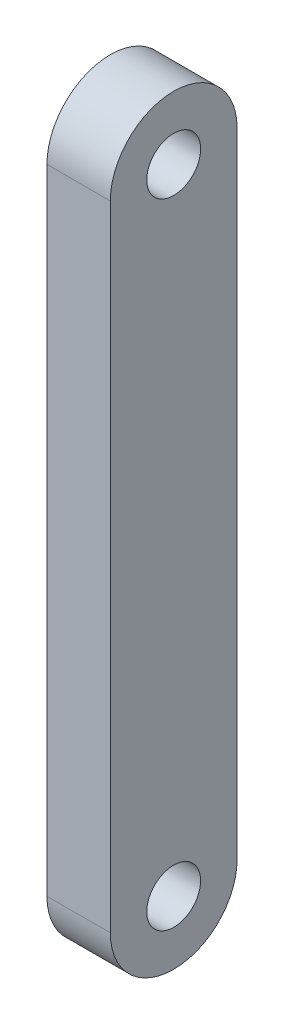
ISO-10303-21;
HEADER;
FILE_DESCRIPTION(('STEP AP214'),'2;1');
FILE_NAME('part.step','',(''),(''),'','','');
FILE_SCHEMA(('AUTOMOTIVE_DESIGN { 1 0 10303 214 1 1 1 1 }'));
ENDSEC;
DATA;
#1=APPLICATION_CONTEXT('core data for automotive mechanical design processes');
#2=APPLICATION_PROTOCOL_DEFINITION('international standard','automotive_design',2000,#1);
#3=PRODUCT_CONTEXT('',#1,'mechanical');
#4=PRODUCT('Part','Part','',(#3));
#5=PRODUCT_RELATED_PRODUCT_CATEGORY('part','',(#4));
#6=PRODUCT_DEFINITION_FORMATION('','',#4);
#7=PRODUCT_DEFINITION_CONTEXT('part definition',#1,'design');
#8=PRODUCT_DEFINITION('design','',#6,#7);
#9=PRODUCT_DEFINITION_SHAPE('','',#8);
#10=(LENGTH_UNIT() NAMED_UNIT(*) SI_UNIT(.MILLI.,.METRE.));
#11=(NAMED_UNIT(*) PLANE_ANGLE_UNIT() SI_UNIT($,.RADIAN.));
#12=(NAMED_UNIT(*) SI_UNIT($,.STERADIAN.) SOLID_ANGLE_UNIT());
#13=UNCERTAINTY_MEASURE_WITH_UNIT(LENGTH_MEASURE(1.E-05),#10,'distance_accuracy_value','');
#14=(GEOMETRIC_REPRESENTATION_CONTEXT(3) GLOBAL_UNCERTAINTY_ASSIGNED_CONTEXT((#13)) GLOBAL_UNIT_ASSIGNED_CONTEXT((#10,
#11,#12)) REPRESENTATION_CONTEXT('',''));
#15=CARTESIAN_POINT('',(0.,0.,0.));
#16=DIRECTION('',(0.,0.,1.));
#17=DIRECTION('',(1.,0.,0.));
#18=AXIS2_PLACEMENT_3D('',#15,#16,#17);
#19=CARTESIAN_POINT('',(5.,-50.,0.));
#20=DIRECTION('',(1.,0.,0.));
#21=DIRECTION('',(0.,0.,-1.));
#22=AXIS2_PLACEMENT_3D('',#19,#20,#21);
#23=PLANE('',#22);
#24=CARTESIAN_POINT('',(5.,50.,0.));
#25=DIRECTION('',(1.,0.,0.));
#26=DIRECTION('',(0.,0.,-1.));
#27=AXIS2_PLACEMENT_3D('',#24,#25,#26);
#28=CIRCLE('',#27,4.25);
#29=CARTESIAN_POINT('',(5.,50.,-4.25));
#30=VERTEX_POINT('',#29);
#31=EDGE_CURVE('E108',#30,#30,#28,.T.);
#32=ORIENTED_EDGE('',*,*,#31,.F.);
#33=EDGE_LOOP('',(#32));
#34=FACE_BOUND('',#33,.T.);
#35=CARTESIAN_POINT('',(5.,-50.,0.));
#36=DIRECTION('',(1.,0.,0.));
#37=DIRECTION('',(0.,0.,-1.));
#38=AXIS2_PLACEMENT_3D('',#35,#36,#37);
#39=CIRCLE('',#38,10.);
#40=CARTESIAN_POINT('',(5.,-50.,10.));
#41=VERTEX_POINT('',#40);
#42=CARTESIAN_POINT('',(5.,-50.,-10.));
#43=VERTEX_POINT('',#42);
#44=EDGE_CURVE('E93',#41,#43,#39,.T.);
#45=ORIENTED_EDGE('',*,*,#44,.T.);
#46=DIRECTION('',(0.,1.,0.));
#47=VECTOR('',#46,1.);
#48=CARTESIAN_POINT('',(5.,-50.,-10.));
#49=LINE('',#48,#47);
#50=CARTESIAN_POINT('',(5.,50.,-10.));
#51=VERTEX_POINT('',#50);
#52=EDGE_CURVE('E88',#43,#51,#49,.T.);
#53=ORIENTED_EDGE('',*,*,#52,.T.);
#54=CARTESIAN_POINT('',(5.,50.,0.));
#55=DIRECTION('',(1.,0.,0.));
#56=DIRECTION('',(0.,0.,-1.));
#57=AXIS2_PLACEMENT_3D('',#54,#55,#56);
#58=CIRCLE('',#57,10.);
#59=CARTESIAN_POINT('',(5.,50.,10.));
#60=VERTEX_POINT('',#59);
#61=EDGE_CURVE('E91',#51,#60,#58,.T.);
#62=ORIENTED_EDGE('',*,*,#61,.T.);
#63=DIRECTION('',(0.,-1.,0.));
#64=VECTOR('',#63,1.);
#65=CARTESIAN_POINT('',(5.,-50.,10.));
#66=LINE('',#65,#64);
#67=EDGE_CURVE('E58',#60,#41,#66,.T.);
#68=ORIENTED_EDGE('',*,*,#67,.T.);
#69=EDGE_LOOP('',(#45,#53,#62,#68));
#70=FACE_BOUND('',#69,.T.);
#71=CARTESIAN_POINT('',(5.,-50.,0.));
#72=DIRECTION('',(1.,0.,0.));
#73=DIRECTION('',(0.,0.,-1.));
#74=AXIS2_PLACEMENT_3D('',#71,#72,#73);
#75=CIRCLE('',#74,4.25);
#76=CARTESIAN_POINT('',(5.,-50.,-4.25));
#77=VERTEX_POINT('',#76);
#78=EDGE_CURVE('E123',#77,#77,#75,.T.);
#79=ORIENTED_EDGE('',*,*,#78,.F.);
#80=EDGE_LOOP('',(#79));
#81=FACE_BOUND('',#80,.T.);
#82=ADVANCED_FACE('F41',(#34,#70,#81),#23,.T.);
#83=CARTESIAN_POINT('',(-5.,-50.,0.));
#84=DIRECTION('',(1.,0.,0.));
#85=DIRECTION('',(0.,0.,-1.));
#86=AXIS2_PLACEMENT_3D('',#83,#84,#85);
#87=PLANE('',#86);
#88=CARTESIAN_POINT('',(-5.,-50.,0.));
#89=DIRECTION('',(1.,0.,0.));
#90=DIRECTION('',(0.,0.,-1.));
#91=AXIS2_PLACEMENT_3D('',#88,#89,#90);
#92=CIRCLE('',#91,10.);
#93=CARTESIAN_POINT('',(-5.,-50.,10.));
#94=VERTEX_POINT('',#93);
#95=CARTESIAN_POINT('',(-5.,-50.,-10.));
#96=VERTEX_POINT('',#95);
#97=EDGE_CURVE('E105',#94,#96,#92,.T.);
#98=ORIENTED_EDGE('',*,*,#97,.F.);
#99=DIRECTION('',(0.,-1.,0.));
#100=VECTOR('',#99,1.);
#101=CARTESIAN_POINT('',(-5.,-50.,10.));
#102=LINE('',#101,#100);
#103=CARTESIAN_POINT('',(-5.,50.,10.));
#104=VERTEX_POINT('',#103);
#105=EDGE_CURVE('E81',#104,#94,#102,.T.);
#106=ORIENTED_EDGE('',*,*,#105,.F.);
#107=CARTESIAN_POINT('',(-5.,50.,0.));
#108=DIRECTION('',(1.,0.,0.));
#109=DIRECTION('',(0.,0.,-1.));
#110=AXIS2_PLACEMENT_3D('',#107,#108,#109);
#111=CIRCLE('',#110,10.);
#112=CARTESIAN_POINT('',(-5.,50.,-10.));
#113=VERTEX_POINT('',#112);
#114=EDGE_CURVE('E75',#113,#104,#111,.T.);
#115=ORIENTED_EDGE('',*,*,#114,.F.);
#116=DIRECTION('',(0.,1.,0.));
#117=VECTOR('',#116,1.);
#118=CARTESIAN_POINT('',(-5.,-50.,-10.));
#119=LINE('',#118,#117);
#120=EDGE_CURVE('E97',#96,#113,#119,.T.);
#121=ORIENTED_EDGE('',*,*,#120,.F.);
#122=EDGE_LOOP('',(#98,#106,#115,#121));
#123=FACE_BOUND('',#122,.T.);
#124=CARTESIAN_POINT('',(-5.,50.,0.));
#125=DIRECTION('',(1.,0.,0.));
#126=DIRECTION('',(0.,0.,-1.));
#127=AXIS2_PLACEMENT_3D('',#124,#125,#126);
#128=CIRCLE('',#127,4.25);
#129=CARTESIAN_POINT('',(-5.,50.,-4.25));
#130=VERTEX_POINT('',#129);
#131=EDGE_CURVE('E120',#130,#130,#128,.T.);
#132=ORIENTED_EDGE('',*,*,#131,.T.);
#133=EDGE_LOOP('',(#132));
#134=FACE_BOUND('',#133,.T.);
#135=CARTESIAN_POINT('',(-5.,-50.,0.));
#136=DIRECTION('',(1.,0.,0.));
#137=DIRECTION('',(0.,0.,-1.));
#138=AXIS2_PLACEMENT_3D('',#135,#136,#137);
#139=CIRCLE('',#138,4.25);
#140=CARTESIAN_POINT('',(-5.,-50.,-4.25));
#141=VERTEX_POINT('',#140);
#142=EDGE_CURVE('E126',#141,#141,#139,.T.);
#143=ORIENTED_EDGE('',*,*,#142,.T.);
#144=EDGE_LOOP('',(#143));
#145=FACE_BOUND('',#144,.T.);
#146=ADVANCED_FACE('F116',(#123,#134,#145),#87,.F.);
#147=CARTESIAN_POINT('',(5.,-50.,0.));
#148=DIRECTION('',(-1.,0.,0.));
#149=DIRECTION('',(0.,0.,1.));
#150=AXIS2_PLACEMENT_3D('',#147,#148,#149);
#151=CYLINDRICAL_SURFACE('',#150,10.);
#152=ORIENTED_EDGE('',*,*,#97,.T.);
#153=DIRECTION('',(-1.,0.,0.));
#154=VECTOR('',#153,1.);
#155=CARTESIAN_POINT('',(5.,-50.,-10.));
#156=LINE('',#155,#154);
#157=EDGE_CURVE('E11',#43,#96,#156,.T.);
#158=ORIENTED_EDGE('',*,*,#157,.F.);
#159=ORIENTED_EDGE('',*,*,#44,.F.);
#160=DIRECTION('',(-1.,0.,0.));
#161=VECTOR('',#160,1.);
#162=CARTESIAN_POINT('',(5.,-50.,10.));
#163=LINE('',#162,#161);
#164=EDGE_CURVE('E101',#41,#94,#163,.T.);
#165=ORIENTED_EDGE('',*,*,#164,.T.);
#166=EDGE_LOOP('',(#152,#158,#159,#165));
#167=FACE_BOUND('',#166,.T.);
#168=ADVANCED_FACE('F43',(#167),#151,.T.);
#169=CARTESIAN_POINT('',(5.,-50.,-10.));
#170=DIRECTION('',(0.,0.,1.));
#171=DIRECTION('',(0.,-1.,0.));
#172=AXIS2_PLACEMENT_3D('',#169,#170,#171);
#173=PLANE('',#172);
#174=ORIENTED_EDGE('',*,*,#120,.T.);
#175=DIRECTION('',(-1.,0.,0.));
#176=VECTOR('',#175,1.);
#177=CARTESIAN_POINT('',(5.,50.,-10.));
#178=LINE('',#177,#176);
#179=EDGE_CURVE('E50',#51,#113,#178,.T.);
#180=ORIENTED_EDGE('',*,*,#179,.F.);
#181=ORIENTED_EDGE('',*,*,#52,.F.);
#182=ORIENTED_EDGE('',*,*,#157,.T.);
#183=EDGE_LOOP('',(#174,#180,#181,#182));
#184=FACE_BOUND('',#183,.T.);
#185=ADVANCED_FACE('F96',(#184),#173,.F.);
#186=CARTESIAN_POINT('',(5.,50.,0.));
#187=DIRECTION('',(-1.,0.,0.));
#188=DIRECTION('',(0.,0.,1.));
#189=AXIS2_PLACEMENT_3D('',#186,#187,#188);
#190=CYLINDRICAL_SURFACE('',#189,10.);
#191=ORIENTED_EDGE('',*,*,#114,.T.);
#192=DIRECTION('',(-1.,0.,0.));
#193=VECTOR('',#192,1.);
#194=CARTESIAN_POINT('',(5.,50.,10.));
#195=LINE('',#194,#193);
#196=EDGE_CURVE('E98',#60,#104,#195,.T.);
#197=ORIENTED_EDGE('',*,*,#196,.F.);
#198=ORIENTED_EDGE('',*,*,#61,.F.);
#199=ORIENTED_EDGE('',*,*,#179,.T.);
#200=EDGE_LOOP('',(#191,#197,#198,#199));
#201=FACE_BOUND('',#200,.T.);
#202=ADVANCED_FACE('F99',(#201),#190,.T.);
#203=CARTESIAN_POINT('',(5.,-50.,10.));
#204=DIRECTION('',(0.,0.,-1.));
#205=DIRECTION('',(0.,1.,0.));
#206=AXIS2_PLACEMENT_3D('',#203,#204,#205);
#207=PLANE('',#206);
#208=ORIENTED_EDGE('',*,*,#105,.T.);
#209=ORIENTED_EDGE('',*,*,#164,.F.);
#210=ORIENTED_EDGE('',*,*,#67,.F.);
#211=ORIENTED_EDGE('',*,*,#196,.T.);
#212=EDGE_LOOP('',(#208,#209,#210,#211));
#213=FACE_BOUND('',#212,.T.);
#214=ADVANCED_FACE('F113',(#213),#207,.F.);
#215=CARTESIAN_POINT('',(5.,50.,0.));
#216=DIRECTION('',(-1.,0.,0.));
#217=DIRECTION('',(0.,0.,1.));
#218=AXIS2_PLACEMENT_3D('',#215,#216,#217);
#219=CYLINDRICAL_SURFACE('',#218,4.25);
#220=ORIENTED_EDGE('',*,*,#31,.T.);
#221=EDGE_LOOP('',(#220));
#222=FACE_BOUND('',#221,.T.);
#223=ORIENTED_EDGE('',*,*,#131,.F.);
#224=EDGE_LOOP('',(#223));
#225=FACE_BOUND('',#224,.T.);
#226=ADVANCED_FACE('F143',(#222,#225),#219,.F.);
#227=CARTESIAN_POINT('',(5.,-50.,0.));
#228=DIRECTION('',(-1.,0.,0.));
#229=DIRECTION('',(0.,0.,1.));
#230=AXIS2_PLACEMENT_3D('',#227,#228,#229);
#231=CYLINDRICAL_SURFACE('',#230,4.25);
#232=ORIENTED_EDGE('',*,*,#78,.T.);
#233=EDGE_LOOP('',(#232));
#234=FACE_BOUND('',#233,.T.);
#235=ORIENTED_EDGE('',*,*,#142,.F.);
#236=EDGE_LOOP('',(#235));
#237=FACE_BOUND('',#236,.T.);
#238=ADVANCED_FACE('F132',(#234,#237),#231,.F.);
#239=CLOSED_SHELL('',(#82,#146,#168,#185,#202,#214,#226,#238));
#240=MANIFOLD_SOLID_BREP('B2',#239);
#241=ADVANCED_BREP_SHAPE_REPRESENTATION('',(#18,#240),#14);
#242=SHAPE_DEFINITION_REPRESENTATION(#9,#241);
ENDSEC;
END-ISO-10303-21;
